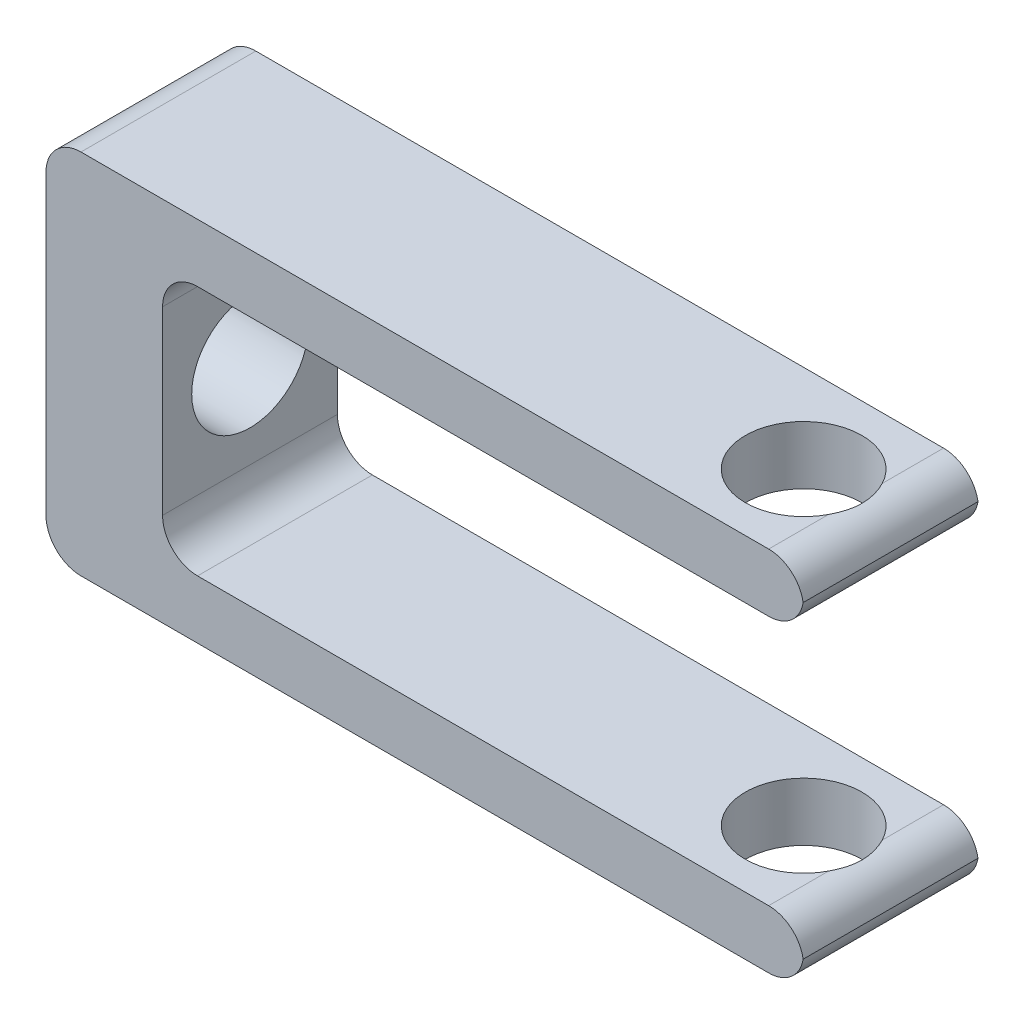
ISO-10303-21;
HEADER;
FILE_DESCRIPTION(('STEP AP214'),'2;1');
FILE_NAME('part.step','',(''),(''),'','','');
FILE_SCHEMA(('AUTOMOTIVE_DESIGN { 1 0 10303 214 1 1 1 1 }'));
ENDSEC;
DATA;
#1=APPLICATION_CONTEXT('core data for automotive mechanical design processes');
#2=APPLICATION_PROTOCOL_DEFINITION('international standard','automotive_design',2000,#1);
#3=PRODUCT_CONTEXT('',#1,'mechanical');
#4=PRODUCT('Part','Part','',(#3));
#5=PRODUCT_RELATED_PRODUCT_CATEGORY('part','',(#4));
#6=PRODUCT_DEFINITION_FORMATION('','',#4);
#7=PRODUCT_DEFINITION_CONTEXT('part definition',#1,'design');
#8=PRODUCT_DEFINITION('design','',#6,#7);
#9=PRODUCT_DEFINITION_SHAPE('','',#8);
#10=(LENGTH_UNIT() NAMED_UNIT(*) SI_UNIT(.MILLI.,.METRE.));
#11=(NAMED_UNIT(*) PLANE_ANGLE_UNIT() SI_UNIT($,.RADIAN.));
#12=(NAMED_UNIT(*) SI_UNIT($,.STERADIAN.) SOLID_ANGLE_UNIT());
#13=UNCERTAINTY_MEASURE_WITH_UNIT(LENGTH_MEASURE(1.E-05),#10,'distance_accuracy_value','');
#14=(GEOMETRIC_REPRESENTATION_CONTEXT(3) GLOBAL_UNCERTAINTY_ASSIGNED_CONTEXT((#13)) GLOBAL_UNIT_ASSIGNED_CONTEXT((#10,
#11,#12)) REPRESENTATION_CONTEXT('',''));
#15=CARTESIAN_POINT('',(0.,0.,0.));
#16=DIRECTION('',(0.,0.,1.));
#17=DIRECTION('',(1.,0.,0.));
#18=AXIS2_PLACEMENT_3D('',#15,#16,#17);
#19=CARTESIAN_POINT('',(12.7,0.,0.));
#20=DIRECTION('',(-1.,0.,0.));
#21=DIRECTION('',(0.,0.,1.));
#22=AXIS2_PLACEMENT_3D('',#19,#20,#21);
#23=PLANE('',#22);
#24=CARTESIAN_POINT('',(12.7,20.,-9.525));
#25=DIRECTION('',(-1.,0.,0.));
#26=DIRECTION('',(0.,0.,1.));
#27=AXIS2_PLACEMENT_3D('',#24,#25,#26);
#28=CIRCLE('',#27,6.35);
#29=CARTESIAN_POINT('',(12.7,20.,-3.175));
#30=VERTEX_POINT('',#29);
#31=EDGE_CURVE('E559',#30,#30,#28,.F.);
#32=ORIENTED_EDGE('',*,*,#31,.F.);
#33=EDGE_LOOP('',(#32));
#34=FACE_BOUND('',#33,.T.);
#35=DIRECTION('',(0.,1.,0.));
#36=VECTOR('',#35,1.);
#37=CARTESIAN_POINT('',(12.7,0.,-19.05));
#38=LINE('',#37,#36);
#39=CARTESIAN_POINT('',(12.7,10.16,-19.05));
#40=VERTEX_POINT('',#39);
#41=CARTESIAN_POINT('',(12.7,29.84,-19.05));
#42=VERTEX_POINT('',#41);
#43=EDGE_CURVE('E535',#40,#42,#38,.T.);
#44=ORIENTED_EDGE('',*,*,#43,.T.);
#45=DIRECTION('',(0.,0.,-1.));
#46=VECTOR('',#45,1.);
#47=CARTESIAN_POINT('',(12.7,29.84,0.));
#48=LINE('',#47,#46);
#49=CARTESIAN_POINT('',(12.7,29.84,0.));
#50=VERTEX_POINT('',#49);
#51=EDGE_CURVE('E463',#42,#50,#48,.F.);
#52=ORIENTED_EDGE('',*,*,#51,.T.);
#53=DIRECTION('',(0.,-1.,0.));
#54=VECTOR('',#53,1.);
#55=CARTESIAN_POINT('',(12.7,0.,0.));
#56=LINE('',#55,#54);
#57=CARTESIAN_POINT('',(12.7,10.16,0.));
#58=VERTEX_POINT('',#57);
#59=EDGE_CURVE('E539',#50,#58,#56,.T.);
#60=ORIENTED_EDGE('',*,*,#59,.T.);
#61=DIRECTION('',(0.,0.,1.));
#62=VECTOR('',#61,1.);
#63=CARTESIAN_POINT('',(12.7,10.16,-19.05));
#64=LINE('',#63,#62);
#65=EDGE_CURVE('E460',#58,#40,#64,.F.);
#66=ORIENTED_EDGE('',*,*,#65,.T.);
#67=EDGE_LOOP('',(#44,#52,#60,#66));
#68=FACE_BOUND('',#67,.T.);
#69=ADVANCED_FACE('F41',(#34,#68),#23,.F.);
#70=CARTESIAN_POINT('',(12.7,0.,0.));
#71=DIRECTION('',(0.,0.,-1.));
#72=DIRECTION('',(0.,1.,0.));
#73=AXIS2_PLACEMENT_3D('',#70,#71,#72);
#74=PLANE('',#73);
#75=DIRECTION('',(0.,-1.,0.));
#76=VECTOR('',#75,1.);
#77=CARTESIAN_POINT('',(0.,0.,0.));
#78=LINE('',#77,#76);
#79=CARTESIAN_POINT('',(0.,36.19,0.));
#80=VERTEX_POINT('',#79);
#81=CARTESIAN_POINT('',(0.,3.81,0.));
#82=VERTEX_POINT('',#81);
#83=EDGE_CURVE('E454',#80,#82,#78,.T.);
#84=ORIENTED_EDGE('',*,*,#83,.T.);
#85=CARTESIAN_POINT('',(3.81,3.81,0.));
#86=DIRECTION('',(0.,0.,-1.));
#87=DIRECTION('',(0.,1.,0.));
#88=AXIS2_PLACEMENT_3D('',#85,#86,#87);
#89=CIRCLE('',#88,3.81);
#90=CARTESIAN_POINT('',(3.81,0.,0.));
#91=VERTEX_POINT('',#90);
#92=EDGE_CURVE('E515',#82,#91,#89,.F.);
#93=ORIENTED_EDGE('',*,*,#92,.T.);
#94=DIRECTION('',(-1.,0.,0.));
#95=VECTOR('',#94,1.);
#96=CARTESIAN_POINT('',(12.7,0.,0.));
#97=LINE('',#96,#95);
#98=CARTESIAN_POINT('',(78.74,0.,0.));
#99=VERTEX_POINT('',#98);
#100=EDGE_CURVE('E485',#99,#91,#97,.T.);
#101=ORIENTED_EDGE('',*,*,#100,.F.);
#102=CARTESIAN_POINT('',(78.74,3.81,0.));
#103=DIRECTION('',(0.,0.,-1.));
#104=DIRECTION('',(0.,1.,0.));
#105=AXIS2_PLACEMENT_3D('',#102,#103,#104);
#106=CIRCLE('',#105,3.81);
#107=CARTESIAN_POINT('',(82.4967106622683,3.175,0.));
#108=VERTEX_POINT('',#107);
#109=EDGE_CURVE('E509',#99,#108,#106,.F.);
#110=ORIENTED_EDGE('',*,*,#109,.T.);
#111=CARTESIAN_POINT('',(78.74,2.54,0.));
#112=DIRECTION('',(0.,0.,-1.));
#113=DIRECTION('',(0.,1.,0.));
#114=AXIS2_PLACEMENT_3D('',#111,#112,#113);
#115=CIRCLE('',#114,3.81);
#116=CARTESIAN_POINT('',(78.74,6.35,0.));
#117=VERTEX_POINT('',#116);
#118=EDGE_CURVE('E511',#108,#117,#115,.F.);
#119=ORIENTED_EDGE('',*,*,#118,.T.);
#120=DIRECTION('',(-1.,0.,0.));
#121=VECTOR('',#120,1.);
#122=CARTESIAN_POINT('',(82.55,6.35,0.));
#123=LINE('',#122,#121);
#124=CARTESIAN_POINT('',(16.51,6.35,0.));
#125=VERTEX_POINT('',#124);
#126=EDGE_CURVE('E475',#117,#125,#123,.T.);
#127=ORIENTED_EDGE('',*,*,#126,.T.);
#128=CARTESIAN_POINT('',(16.51,10.16,0.));
#129=DIRECTION('',(0.,0.,-1.));
#130=DIRECTION('',(0.,1.,0.));
#131=AXIS2_PLACEMENT_3D('',#128,#129,#130);
#132=CIRCLE('',#131,3.81);
#133=EDGE_CURVE('E51',#125,#58,#132,.T.);
#134=ORIENTED_EDGE('',*,*,#133,.T.);
#135=ORIENTED_EDGE('',*,*,#59,.F.);
#136=CARTESIAN_POINT('',(16.51,29.84,0.));
#137=DIRECTION('',(0.,0.,-1.));
#138=DIRECTION('',(0.,1.,0.));
#139=AXIS2_PLACEMENT_3D('',#136,#137,#138);
#140=CIRCLE('',#139,3.81);
#141=CARTESIAN_POINT('',(16.51,33.65,0.));
#142=VERTEX_POINT('',#141);
#143=EDGE_CURVE('E459',#50,#142,#140,.T.);
#144=ORIENTED_EDGE('',*,*,#143,.T.);
#145=DIRECTION('',(-1.,0.,0.));
#146=VECTOR('',#145,1.);
#147=CARTESIAN_POINT('',(82.55,33.65,0.));
#148=LINE('',#147,#146);
#149=CARTESIAN_POINT('',(78.74,33.65,0.));
#150=VERTEX_POINT('',#149);
#151=EDGE_CURVE('E445',#150,#142,#148,.T.);
#152=ORIENTED_EDGE('',*,*,#151,.F.);
#153=CARTESIAN_POINT('',(78.74,37.46,0.));
#154=DIRECTION('',(0.,0.,-1.));
#155=DIRECTION('',(0.,1.,0.));
#156=AXIS2_PLACEMENT_3D('',#153,#154,#155);
#157=CIRCLE('',#156,3.81);
#158=CARTESIAN_POINT('',(82.4967106622683,36.825,0.));
#159=VERTEX_POINT('',#158);
#160=EDGE_CURVE('E507',#150,#159,#157,.F.);
#161=ORIENTED_EDGE('',*,*,#160,.T.);
#162=CARTESIAN_POINT('',(78.74,36.19,0.));
#163=DIRECTION('',(0.,0.,-1.));
#164=DIRECTION('',(0.,1.,0.));
#165=AXIS2_PLACEMENT_3D('',#162,#163,#164);
#166=CIRCLE('',#165,3.81);
#167=CARTESIAN_POINT('',(78.74,40.,0.));
#168=VERTEX_POINT('',#167);
#169=EDGE_CURVE('E505',#159,#168,#166,.F.);
#170=ORIENTED_EDGE('',*,*,#169,.T.);
#171=DIRECTION('',(-1.,0.,0.));
#172=VECTOR('',#171,1.);
#173=CARTESIAN_POINT('',(12.7,40.,0.));
#174=LINE('',#173,#172);
#175=CARTESIAN_POINT('',(3.81,40.,0.));
#176=VERTEX_POINT('',#175);
#177=EDGE_CURVE('E527',#168,#176,#174,.T.);
#178=ORIENTED_EDGE('',*,*,#177,.T.);
#179=CARTESIAN_POINT('',(3.81,36.19,0.));
#180=DIRECTION('',(0.,0.,-1.));
#181=DIRECTION('',(0.,1.,0.));
#182=AXIS2_PLACEMENT_3D('',#179,#180,#181);
#183=CIRCLE('',#182,3.81);
#184=EDGE_CURVE('E513',#176,#80,#183,.F.);
#185=ORIENTED_EDGE('',*,*,#184,.T.);
#186=EDGE_LOOP('',(#84,#93,#101,#110,#119,#127,#134,#135,#144,#152,#161,#170,#178,#185));
#187=FACE_BOUND('',#186,.T.);
#188=ADVANCED_FACE('F243',(#187),#74,.F.);
#189=CARTESIAN_POINT('',(12.7,0.,0.));
#190=DIRECTION('',(0.,1.,0.));
#191=DIRECTION('',(0.,0.,1.));
#192=AXIS2_PLACEMENT_3D('',#189,#190,#191);
#193=PLANE('',#192);
#194=ORIENTED_EDGE('',*,*,#100,.T.);
#195=DIRECTION('',(0.,0.,-1.));
#196=VECTOR('',#195,1.);
#197=CARTESIAN_POINT('',(3.81,0.,-19.05));
#198=LINE('',#197,#196);
#199=CARTESIAN_POINT('',(3.81,0.,-19.05));
#200=VERTEX_POINT('',#199);
#201=EDGE_CURVE('E181',#91,#200,#198,.T.);
#202=ORIENTED_EDGE('',*,*,#201,.T.);
#203=DIRECTION('',(-1.,0.,0.));
#204=VECTOR('',#203,1.);
#205=CARTESIAN_POINT('',(12.7,0.,-19.05));
#206=LINE('',#205,#204);
#207=CARTESIAN_POINT('',(78.74,0.,-19.05));
#208=VERTEX_POINT('',#207);
#209=EDGE_CURVE('E177',#208,#200,#206,.T.);
#210=ORIENTED_EDGE('',*,*,#209,.F.);
#211=DIRECTION('',(0.,0.,-1.));
#212=VECTOR('',#211,1.);
#213=CARTESIAN_POINT('',(78.74,0.,0.));
#214=LINE('',#213,#212);
#215=CARTESIAN_POINT('',(78.74,0.,-12.3676874404229));
#216=VERTEX_POINT('',#215);
#217=EDGE_CURVE('E169',#208,#216,#214,.F.);
#218=ORIENTED_EDGE('',*,*,#217,.T.);
#219=CARTESIAN_POINT('',(73.1000000000002,0.,-9.45));
#220=DIRECTION('',(0.,-1.,0.));
#221=DIRECTION('',(0.,0.,-1.));
#222=AXIS2_PLACEMENT_3D('',#219,#220,#221);
#223=CIRCLE('',#222,6.35);
#224=CARTESIAN_POINT('',(78.74,0.,-6.53231255957706));
#225=VERTEX_POINT('',#224);
#226=EDGE_CURVE('E173',#225,#216,#223,.T.);
#227=ORIENTED_EDGE('',*,*,#226,.F.);
#228=DIRECTION('',(0.,0.,-1.));
#229=VECTOR('',#228,1.);
#230=CARTESIAN_POINT('',(78.74,0.,0.));
#231=LINE('',#230,#229);
#232=EDGE_CURVE('E182',#225,#99,#231,.F.);
#233=ORIENTED_EDGE('',*,*,#232,.T.);
#234=EDGE_LOOP('',(#194,#202,#210,#218,#227,#233));
#235=FACE_BOUND('',#234,.T.);
#236=ADVANCED_FACE('F172',(#235),#193,.F.);
#237=CARTESIAN_POINT('',(12.7,0.,-19.05));
#238=DIRECTION('',(0.,0.,1.));
#239=DIRECTION('',(0.,-1.,0.));
#240=AXIS2_PLACEMENT_3D('',#237,#238,#239);
#241=PLANE('',#240);
#242=ORIENTED_EDGE('',*,*,#209,.T.);
#243=CARTESIAN_POINT('',(3.81,3.81,-19.05));
#244=DIRECTION('',(0.,0.,1.));
#245=DIRECTION('',(0.,-1.,0.));
#246=AXIS2_PLACEMENT_3D('',#243,#244,#245);
#247=CIRCLE('',#246,3.81);
#248=CARTESIAN_POINT('',(0.,3.81,-19.05));
#249=VERTEX_POINT('',#248);
#250=EDGE_CURVE('E499',#200,#249,#247,.F.);
#251=ORIENTED_EDGE('',*,*,#250,.T.);
#252=DIRECTION('',(0.,1.,0.));
#253=VECTOR('',#252,1.);
#254=CARTESIAN_POINT('',(0.,0.,-19.05));
#255=LINE('',#254,#253);
#256=CARTESIAN_POINT('',(0.,36.19,-19.05));
#257=VERTEX_POINT('',#256);
#258=EDGE_CURVE('E542',#249,#257,#255,.T.);
#259=ORIENTED_EDGE('',*,*,#258,.T.);
#260=CARTESIAN_POINT('',(3.81,36.19,-19.05));
#261=DIRECTION('',(0.,0.,1.));
#262=DIRECTION('',(0.,-1.,0.));
#263=AXIS2_PLACEMENT_3D('',#260,#261,#262);
#264=CIRCLE('',#263,3.81);
#265=CARTESIAN_POINT('',(3.81,40.,-19.05));
#266=VERTEX_POINT('',#265);
#267=EDGE_CURVE('E497',#257,#266,#264,.F.);
#268=ORIENTED_EDGE('',*,*,#267,.T.);
#269=DIRECTION('',(-1.,0.,0.));
#270=VECTOR('',#269,1.);
#271=CARTESIAN_POINT('',(12.7,40.,-19.05));
#272=LINE('',#271,#270);
#273=CARTESIAN_POINT('',(78.74,40.,-19.05));
#274=VERTEX_POINT('',#273);
#275=EDGE_CURVE('E530',#274,#266,#272,.T.);
#276=ORIENTED_EDGE('',*,*,#275,.F.);
#277=CARTESIAN_POINT('',(78.74,36.19,-19.05));
#278=DIRECTION('',(0.,0.,1.));
#279=DIRECTION('',(0.,-1.,0.));
#280=AXIS2_PLACEMENT_3D('',#277,#278,#279);
#281=CIRCLE('',#280,3.81);
#282=CARTESIAN_POINT('',(82.4967106622683,36.825,-19.05));
#283=VERTEX_POINT('',#282);
#284=EDGE_CURVE('E489',#274,#283,#281,.F.);
#285=ORIENTED_EDGE('',*,*,#284,.T.);
#286=CARTESIAN_POINT('',(78.74,37.46,-19.05));
#287=DIRECTION('',(0.,0.,1.));
#288=DIRECTION('',(0.,-1.,0.));
#289=AXIS2_PLACEMENT_3D('',#286,#287,#288);
#290=CIRCLE('',#289,3.81);
#291=CARTESIAN_POINT('',(78.74,33.65,-19.05));
#292=VERTEX_POINT('',#291);
#293=EDGE_CURVE('E491',#283,#292,#290,.F.);
#294=ORIENTED_EDGE('',*,*,#293,.T.);
#295=DIRECTION('',(-1.,0.,0.));
#296=VECTOR('',#295,1.);
#297=CARTESIAN_POINT('',(82.55,33.65,-19.05));
#298=LINE('',#297,#296);
#299=CARTESIAN_POINT('',(16.51,33.65,-19.05));
#300=VERTEX_POINT('',#299);
#301=EDGE_CURVE('E455',#292,#300,#298,.T.);
#302=ORIENTED_EDGE('',*,*,#301,.T.);
#303=CARTESIAN_POINT('',(16.51,29.84,-19.05));
#304=DIRECTION('',(0.,0.,1.));
#305=DIRECTION('',(0.,-1.,0.));
#306=AXIS2_PLACEMENT_3D('',#303,#304,#305);
#307=CIRCLE('',#306,3.81);
#308=EDGE_CURVE('E231',#300,#42,#307,.T.);
#309=ORIENTED_EDGE('',*,*,#308,.T.);
#310=ORIENTED_EDGE('',*,*,#43,.F.);
#311=CARTESIAN_POINT('',(16.51,10.16,-19.05));
#312=DIRECTION('',(0.,0.,1.));
#313=DIRECTION('',(0.,-1.,0.));
#314=AXIS2_PLACEMENT_3D('',#311,#312,#313);
#315=CIRCLE('',#314,3.81);
#316=CARTESIAN_POINT('',(16.51,6.35,-19.05));
#317=VERTEX_POINT('',#316);
#318=EDGE_CURVE('E11',#40,#317,#315,.T.);
#319=ORIENTED_EDGE('',*,*,#318,.T.);
#320=DIRECTION('',(-1.,0.,0.));
#321=VECTOR('',#320,1.);
#322=CARTESIAN_POINT('',(82.55,6.35,-19.05));
#323=LINE('',#322,#321);
#324=CARTESIAN_POINT('',(78.74,6.35,-19.05));
#325=VERTEX_POINT('',#324);
#326=EDGE_CURVE('E556',#325,#317,#323,.T.);
#327=ORIENTED_EDGE('',*,*,#326,.F.);
#328=CARTESIAN_POINT('',(78.74,2.54,-19.05));
#329=DIRECTION('',(0.,0.,1.));
#330=DIRECTION('',(0.,-1.,0.));
#331=AXIS2_PLACEMENT_3D('',#328,#329,#330);
#332=CIRCLE('',#331,3.81);
#333=CARTESIAN_POINT('',(82.4967106622683,3.175,-19.05));
#334=VERTEX_POINT('',#333);
#335=EDGE_CURVE('E495',#325,#334,#332,.F.);
#336=ORIENTED_EDGE('',*,*,#335,.T.);
#337=CARTESIAN_POINT('',(78.74,3.81,-19.05));
#338=DIRECTION('',(0.,0.,1.));
#339=DIRECTION('',(0.,-1.,0.));
#340=AXIS2_PLACEMENT_3D('',#337,#338,#339);
#341=CIRCLE('',#340,3.81);
#342=EDGE_CURVE('E493',#334,#208,#341,.F.);
#343=ORIENTED_EDGE('',*,*,#342,.T.);
#344=EDGE_LOOP('',(#242,#251,#259,#268,#276,#285,#294,#302,#309,#310,#319,#327,#336,#343));
#345=FACE_BOUND('',#344,.T.);
#346=ADVANCED_FACE('F263',(#345),#241,.F.);
#347=CARTESIAN_POINT('',(12.7,40.,0.));
#348=DIRECTION('',(0.,-1.,0.));
#349=DIRECTION('',(0.,0.,-1.));
#350=AXIS2_PLACEMENT_3D('',#347,#348,#349);
#351=PLANE('',#350);
#352=ORIENTED_EDGE('',*,*,#275,.T.);
#353=DIRECTION('',(0.,0.,1.));
#354=VECTOR('',#353,1.);
#355=CARTESIAN_POINT('',(3.81,40.,0.));
#356=LINE('',#355,#354);
#357=EDGE_CURVE('E521',#266,#176,#356,.T.);
#358=ORIENTED_EDGE('',*,*,#357,.T.);
#359=ORIENTED_EDGE('',*,*,#177,.F.);
#360=DIRECTION('',(0.,0.,1.));
#361=VECTOR('',#360,1.);
#362=CARTESIAN_POINT('',(78.74,40.,-19.05));
#363=LINE('',#362,#361);
#364=CARTESIAN_POINT('',(78.74,40.,-6.53231255957706));
#365=VERTEX_POINT('',#364);
#366=EDGE_CURVE('E519',#168,#365,#363,.F.);
#367=ORIENTED_EDGE('',*,*,#366,.T.);
#368=CARTESIAN_POINT('',(73.1000000000002,40.,-9.45));
#369=DIRECTION('',(0.,-1.,0.));
#370=DIRECTION('',(0.,0.,-1.));
#371=AXIS2_PLACEMENT_3D('',#368,#369,#370);
#372=CIRCLE('',#371,6.35);
#373=CARTESIAN_POINT('',(78.74,40.,-12.3676874404229));
#374=VERTEX_POINT('',#373);
#375=EDGE_CURVE('E187',#365,#374,#372,.T.);
#376=ORIENTED_EDGE('',*,*,#375,.T.);
#377=DIRECTION('',(0.,0.,1.));
#378=VECTOR('',#377,1.);
#379=CARTESIAN_POINT('',(78.74,40.,-19.05));
#380=LINE('',#379,#378);
#381=EDGE_CURVE('E517',#374,#274,#380,.F.);
#382=ORIENTED_EDGE('',*,*,#381,.T.);
#383=EDGE_LOOP('',(#352,#358,#359,#367,#376,#382));
#384=FACE_BOUND('',#383,.T.);
#385=ADVANCED_FACE('F259',(#384),#351,.F.);
#386=CARTESIAN_POINT('',(0.,0.,0.));
#387=DIRECTION('',(-1.,0.,0.));
#388=DIRECTION('',(0.,0.,1.));
#389=AXIS2_PLACEMENT_3D('',#386,#387,#388);
#390=PLANE('',#389);
#391=CARTESIAN_POINT('',(0.,20.,-9.525));
#392=DIRECTION('',(-1.,0.,0.));
#393=DIRECTION('',(0.,0.,1.));
#394=AXIS2_PLACEMENT_3D('',#391,#392,#393);
#395=CIRCLE('',#394,6.35);
#396=CARTESIAN_POINT('',(0.,20.,-3.175));
#397=VERTEX_POINT('',#396);
#398=EDGE_CURVE('E479',#397,#397,#395,.T.);
#399=ORIENTED_EDGE('',*,*,#398,.F.);
#400=EDGE_LOOP('',(#399));
#401=FACE_BOUND('',#400,.T.);
#402=ORIENTED_EDGE('',*,*,#258,.F.);
#403=DIRECTION('',(0.,0.,-1.));
#404=VECTOR('',#403,1.);
#405=CARTESIAN_POINT('',(0.,3.81,0.));
#406=LINE('',#405,#404);
#407=EDGE_CURVE('E503',#249,#82,#406,.F.);
#408=ORIENTED_EDGE('',*,*,#407,.T.);
#409=ORIENTED_EDGE('',*,*,#83,.F.);
#410=DIRECTION('',(0.,0.,1.));
#411=VECTOR('',#410,1.);
#412=CARTESIAN_POINT('',(0.,36.19,-19.05));
#413=LINE('',#412,#411);
#414=EDGE_CURVE('E501',#80,#257,#413,.F.);
#415=ORIENTED_EDGE('',*,*,#414,.T.);
#416=EDGE_LOOP('',(#402,#408,#409,#415));
#417=FACE_BOUND('',#416,.T.);
#418=ADVANCED_FACE('F256',(#401,#417),#390,.T.);
#419=CARTESIAN_POINT('',(82.55,33.65,0.));
#420=DIRECTION('',(0.,1.,0.));
#421=DIRECTION('',(0.,0.,1.));
#422=AXIS2_PLACEMENT_3D('',#419,#420,#421);
#423=PLANE('',#422);
#424=ORIENTED_EDGE('',*,*,#151,.T.);
#425=DIRECTION('',(0.,0.,-1.));
#426=VECTOR('',#425,1.);
#427=CARTESIAN_POINT('',(16.51,33.65,-19.05));
#428=LINE('',#427,#426);
#429=EDGE_CURVE('E448',#142,#300,#428,.T.);
#430=ORIENTED_EDGE('',*,*,#429,.T.);
#431=ORIENTED_EDGE('',*,*,#301,.F.);
#432=DIRECTION('',(0.,0.,-1.));
#433=VECTOR('',#432,1.);
#434=CARTESIAN_POINT('',(78.74,33.65,0.));
#435=LINE('',#434,#433);
#436=CARTESIAN_POINT('',(78.74,33.65,-12.3676874404229));
#437=VERTEX_POINT('',#436);
#438=EDGE_CURVE('E461',#292,#437,#435,.F.);
#439=ORIENTED_EDGE('',*,*,#438,.T.);
#440=CARTESIAN_POINT('',(73.1000000000002,33.65,-9.45));
#441=DIRECTION('',(0.,1.,0.));
#442=DIRECTION('',(0.,0.,1.));
#443=AXIS2_PLACEMENT_3D('',#440,#441,#442);
#444=CIRCLE('',#443,6.35);
#445=CARTESIAN_POINT('',(78.74,33.65,-6.53231255957706));
#446=VERTEX_POINT('',#445);
#447=EDGE_CURVE('E477',#437,#446,#444,.T.);
#448=ORIENTED_EDGE('',*,*,#447,.T.);
#449=DIRECTION('',(0.,0.,-1.));
#450=VECTOR('',#449,1.);
#451=CARTESIAN_POINT('',(78.74,33.65,0.));
#452=LINE('',#451,#450);
#453=EDGE_CURVE('E452',#446,#150,#452,.F.);
#454=ORIENTED_EDGE('',*,*,#453,.T.);
#455=EDGE_LOOP('',(#424,#430,#431,#439,#448,#454));
#456=FACE_BOUND('',#455,.T.);
#457=ADVANCED_FACE('F255',(#456),#423,.F.);
#458=CARTESIAN_POINT('',(82.55,6.35,0.));
#459=DIRECTION('',(0.,-1.,0.));
#460=DIRECTION('',(0.,0.,-1.));
#461=AXIS2_PLACEMENT_3D('',#458,#459,#460);
#462=PLANE('',#461);
#463=ORIENTED_EDGE('',*,*,#326,.T.);
#464=DIRECTION('',(0.,0.,1.));
#465=VECTOR('',#464,1.);
#466=CARTESIAN_POINT('',(16.51,6.35,0.));
#467=LINE('',#466,#465);
#468=EDGE_CURVE('E192',#317,#125,#467,.T.);
#469=ORIENTED_EDGE('',*,*,#468,.T.);
#470=ORIENTED_EDGE('',*,*,#126,.F.);
#471=DIRECTION('',(0.,0.,1.));
#472=VECTOR('',#471,1.);
#473=CARTESIAN_POINT('',(78.74,6.35,0.));
#474=LINE('',#473,#472);
#475=CARTESIAN_POINT('',(78.74,6.35,-6.53231255957706));
#476=VERTEX_POINT('',#475);
#477=EDGE_CURVE('E197',#117,#476,#474,.F.);
#478=ORIENTED_EDGE('',*,*,#477,.T.);
#479=CARTESIAN_POINT('',(73.1000000000002,6.35,-9.45));
#480=DIRECTION('',(0.,-1.,0.));
#481=DIRECTION('',(0.,0.,-1.));
#482=AXIS2_PLACEMENT_3D('',#479,#480,#481);
#483=CIRCLE('',#482,6.35);
#484=CARTESIAN_POINT('',(78.74,6.35,-12.3676874404229));
#485=VERTEX_POINT('',#484);
#486=EDGE_CURVE('E473',#476,#485,#483,.T.);
#487=ORIENTED_EDGE('',*,*,#486,.T.);
#488=DIRECTION('',(0.,0.,1.));
#489=VECTOR('',#488,1.);
#490=CARTESIAN_POINT('',(78.74,6.35,0.));
#491=LINE('',#490,#489);
#492=EDGE_CURVE('E470',#485,#325,#491,.F.);
#493=ORIENTED_EDGE('',*,*,#492,.T.);
#494=EDGE_LOOP('',(#463,#469,#470,#478,#487,#493));
#495=FACE_BOUND('',#494,.T.);
#496=ADVANCED_FACE('F315',(#495),#462,.F.);
#497=CARTESIAN_POINT('',(82.551,20.,-9.525));
#498=DIRECTION('',(-1.,0.,0.));
#499=DIRECTION('',(0.,0.,1.));
#500=AXIS2_PLACEMENT_3D('',#497,#498,#499);
#501=CYLINDRICAL_SURFACE('',#500,6.35);
#502=ORIENTED_EDGE('',*,*,#398,.T.);
#503=EDGE_LOOP('',(#502));
#504=FACE_BOUND('',#503,.T.);
#505=ORIENTED_EDGE('',*,*,#31,.T.);
#506=EDGE_LOOP('',(#505));
#507=FACE_BOUND('',#506,.T.);
#508=ADVANCED_FACE('F217',(#504,#507),#501,.F.);
#509=CARTESIAN_POINT('',(73.1000000000002,40.,-9.45));
#510=DIRECTION('',(0.,-1.,0.));
#511=DIRECTION('',(0.,0.,-1.));
#512=AXIS2_PLACEMENT_3D('',#509,#510,#511);
#513=CYLINDRICAL_SURFACE('',#512,6.35);
#514=ORIENTED_EDGE('',*,*,#226,.T.);
#515=CARTESIAN_POINT('',(78.74,0.,-12.3676874404229));
#516=CARTESIAN_POINT('',(78.8141669430321,4.21677638576509E-05,-12.2243462053904));
#517=CARTESIAN_POINT('',(78.8828322778943,0.0021667541477509,-12.0781973111076));
#518=CARTESIAN_POINT('',(79.0088135503706,0.00896028764189701,-11.7811794488519));
#519=CARTESIAN_POINT('',(79.0661321126513,0.0136286454026258,-11.6303115818152));
#520=CARTESIAN_POINT('',(79.1690733661252,0.0238872818431314,-11.3247875636011));
#521=CARTESIAN_POINT('',(79.2147039703366,0.0294769325502578,-11.1701340535195));
#522=CARTESIAN_POINT('',(79.294079587128,0.0402909916585191,-10.857780161327));
#523=CARTESIAN_POINT('',(79.3278234806986,0.0455153656355876,-10.7000794938313));
#524=CARTESIAN_POINT('',(79.3859896577,0.0550355613227927,-10.3666551310219));
#525=CARTESIAN_POINT('',(79.4091443727042,0.0591865335181194,-10.1907044329168));
#526=CARTESIAN_POINT('',(79.4406503181169,0.0649437699426842,-9.8374330942771));
#527=CARTESIAN_POINT('',(79.4490007868683,0.066549903243158,-9.66011238372875));
#528=CARTESIAN_POINT('',(79.4508303461197,0.0668968475096115,-9.30537955210745));
#529=CARTESIAN_POINT('',(79.4443084961887,0.0656374772793295,-9.12796742596318));
#530=CARTESIAN_POINT('',(79.4164435733036,0.0605034551550137,-8.77435675750611));
#531=CARTESIAN_POINT('',(79.3951010794083,0.0566289054390558,-8.59815816805073));
#532=CARTESIAN_POINT('',(79.3394902189645,0.0473612079869808,-8.25877188026996));
#533=CARTESIAN_POINT('',(79.3060785890245,0.0420736819041759,-8.09544014147094));
#534=CARTESIAN_POINT('',(79.2265290140866,0.03097877341459,-7.77193892812828));
#535=CARTESIAN_POINT('',(79.1803918552078,0.0251714231348945,-7.61176925890263));
#536=CARTESIAN_POINT('',(79.075602250961,0.0144438143421923,-7.29536133191125));
#537=CARTESIAN_POINT('',(79.0169384791843,0.00952436613740139,-7.13912677611383));
#538=CARTESIAN_POINT('',(78.9198484592949,0.00410963397721732,-6.90857802913846));
#539=CARTESIAN_POINT('',(78.8859620500257,0.0026320354643742,-6.83234809663053));
#540=CARTESIAN_POINT('',(78.8152060066899,0.000578306783763317,-6.68126783508091));
#541=CARTESIAN_POINT('',(78.7783361855512,2.23319142178353E-06,-6.60641759291329));
#542=CARTESIAN_POINT('',(78.74,0.,-6.53231255957706));
#543=B_SPLINE_CURVE_WITH_KNOTS('',3,(#515,#516,#517,#518,#519,#520,#521,#522,#523,#524,#525,
#526,#527,#528,#529,#530,#531,#532,#533,#534,#535,#536,#537,#538,#539,#540,#541,#542),
.UNSPECIFIED.,.F.,.F.,(4,2,2,2,2,2,2,2,2,2,2,2,2,4),(0.,0.483999250872301,0.967886414816064,
1.45144510484421,1.93504930470226,2.46695277393833,2.99888360805118,3.53084807902966,
4.06279176674635,4.56266943435482,5.06251622895115,5.56281690723442,5.81306286888241,
6.06332453414986),.UNSPECIFIED.);
#544=EDGE_CURVE('E186',#216,#225,#543,.T.);
#545=ORIENTED_EDGE('',*,*,#544,.T.);
#546=EDGE_LOOP('',(#514,#545));
#547=FACE_BOUND('',#546,.T.);
#548=ORIENTED_EDGE('',*,*,#486,.F.);
#549=CARTESIAN_POINT('',(78.74,6.35,-6.53231255957706));
#550=CARTESIAN_POINT('',(78.8141669430321,6.34995783223614,-6.67565379460957));
#551=CARTESIAN_POINT('',(78.8828322778943,6.34783324585225,-6.82180268889242));
#552=CARTESIAN_POINT('',(79.0088135503706,6.3410397123581,-7.11882055114807));
#553=CARTESIAN_POINT('',(79.0661321126513,6.33637135459737,-7.26968841818478));
#554=CARTESIAN_POINT('',(79.1690733661252,6.32611271815687,-7.57521243639892));
#555=CARTESIAN_POINT('',(79.2147039703366,6.32052306744974,-7.72986594648046));
#556=CARTESIAN_POINT('',(79.294079587128,6.30970900834148,-8.04221983867304));
#557=CARTESIAN_POINT('',(79.3278234806986,6.30448463436441,-8.19992050616873));
#558=CARTESIAN_POINT('',(79.3859896577,6.29496443867721,-8.53334486897812));
#559=CARTESIAN_POINT('',(79.4091443727042,6.29081346648188,-8.70929556708324));
#560=CARTESIAN_POINT('',(79.4406503181169,6.28505623005732,-9.0625669057229));
#561=CARTESIAN_POINT('',(79.4490007868683,6.28345009675684,-9.23988761627125));
#562=CARTESIAN_POINT('',(79.4508303461197,6.28310315249039,-9.59462044789254));
#563=CARTESIAN_POINT('',(79.4443084961887,6.28436252272067,-9.77203257403681));
#564=CARTESIAN_POINT('',(79.4164435733036,6.28949654484499,-10.1256432424939));
#565=CARTESIAN_POINT('',(79.3951010794083,6.29337109456094,-10.3018418319493));
#566=CARTESIAN_POINT('',(79.3394902189645,6.30263879201302,-10.64122811973));
#567=CARTESIAN_POINT('',(79.3060785890245,6.30792631809582,-10.8045598585291));
#568=CARTESIAN_POINT('',(79.2265290140866,6.31902122658541,-11.1280610718717));
#569=CARTESIAN_POINT('',(79.1803918552078,6.32482857686511,-11.2882307410974));
#570=CARTESIAN_POINT('',(79.075602250961,6.33555618565781,-11.6046386680887));
#571=CARTESIAN_POINT('',(79.0169384791843,6.3404756338626,-11.7608732238862));
#572=CARTESIAN_POINT('',(78.9198484592949,6.34589036602278,-11.9914219708615));
#573=CARTESIAN_POINT('',(78.8859620500257,6.34736796453563,-12.0676519033695));
#574=CARTESIAN_POINT('',(78.8152060066899,6.34942169321624,-12.2187321649191));
#575=CARTESIAN_POINT('',(78.7783361855512,6.34999776680858,-12.2935824070867));
#576=CARTESIAN_POINT('',(78.74,6.35,-12.3676874404229));
#577=B_SPLINE_CURVE_WITH_KNOTS('',3,(#549,#550,#551,#552,#553,#554,#555,#556,#557,#558,#559,
#560,#561,#562,#563,#564,#565,#566,#567,#568,#569,#570,#571,#572,#573,#574,#575,#576),
.UNSPECIFIED.,.F.,.F.,(4,2,2,2,2,2,2,2,2,2,2,2,2,4),(0.,0.483999250872301,0.967886414816063,
1.45144510484421,1.93504930470226,2.46695277393833,2.99888360805118,3.53084807902966,
4.06279176674635,4.56266943435482,5.06251622895115,5.56281690723442,5.81306286888241,
6.06332453414986),.UNSPECIFIED.);
#578=EDGE_CURVE('E59',#476,#485,#577,.T.);
#579=ORIENTED_EDGE('',*,*,#578,.T.);
#580=EDGE_LOOP('',(#548,#579));
#581=FACE_BOUND('',#580,.T.);
#582=ADVANCED_FACE('F185',(#547,#581),#513,.F.);
#583=ORIENTED_EDGE('',*,*,#375,.F.);
#584=CARTESIAN_POINT('',(78.74,40.,-6.53231255957706));
#585=CARTESIAN_POINT('',(78.8141669430321,39.9999578322361,-6.67565379460956));
#586=CARTESIAN_POINT('',(78.8828322778943,39.9978332458522,-6.82180268889242));
#587=CARTESIAN_POINT('',(79.0088135503706,39.9910397123581,-7.11882055114807));
#588=CARTESIAN_POINT('',(79.0661321126513,39.9863713545974,-7.26968841818478));
#589=CARTESIAN_POINT('',(79.1690733661252,39.9761127181569,-7.57521243639892));
#590=CARTESIAN_POINT('',(79.2147039703366,39.9705230674497,-7.72986594648046));
#591=CARTESIAN_POINT('',(79.294079587128,39.9597090083415,-8.04221983867304));
#592=CARTESIAN_POINT('',(79.3278234806986,39.9544846343644,-8.19992050616873));
#593=CARTESIAN_POINT('',(79.3859896577,39.9449644386772,-8.53334486897812));
#594=CARTESIAN_POINT('',(79.4091443727042,39.9408134664819,-8.70929556708324));
#595=CARTESIAN_POINT('',(79.4406503181169,39.9350562300573,-9.0625669057229));
#596=CARTESIAN_POINT('',(79.4490007868683,39.9334500967568,-9.23988761627125));
#597=CARTESIAN_POINT('',(79.4508303461197,39.9331031524904,-9.59462044789254));
#598=CARTESIAN_POINT('',(79.4443084961887,39.9343625227207,-9.77203257403681));
#599=CARTESIAN_POINT('',(79.4164435733036,39.939496544845,-10.1256432424939));
#600=CARTESIAN_POINT('',(79.3951010794083,39.9433710945609,-10.3018418319493));
#601=CARTESIAN_POINT('',(79.3394902189645,39.952638792013,-10.64122811973));
#602=CARTESIAN_POINT('',(79.3060785890245,39.9579263180958,-10.8045598585291));
#603=CARTESIAN_POINT('',(79.2265290140866,39.9690212265854,-11.1280610718717));
#604=CARTESIAN_POINT('',(79.1803918552078,39.9748285768651,-11.2882307410974));
#605=CARTESIAN_POINT('',(79.075602250961,39.9855561856578,-11.6046386680887));
#606=CARTESIAN_POINT('',(79.0169384791843,39.9904756338626,-11.7608732238862));
#607=CARTESIAN_POINT('',(78.9198484592949,39.9958903660228,-11.9914219708615));
#608=CARTESIAN_POINT('',(78.8859620500257,39.9973679645356,-12.0676519033695));
#609=CARTESIAN_POINT('',(78.8152060066899,39.9994216932162,-12.2187321649191));
#610=CARTESIAN_POINT('',(78.7783361855512,39.9999977668086,-12.2935824070867));
#611=CARTESIAN_POINT('',(78.74,40.,-12.3676874404229));
#612=B_SPLINE_CURVE_WITH_KNOTS('',3,(#584,#585,#586,#587,#588,#589,#590,#591,#592,#593,#594,
#595,#596,#597,#598,#599,#600,#601,#602,#603,#604,#605,#606,#607,#608,#609,#610,#611),
.UNSPECIFIED.,.F.,.F.,(4,2,2,2,2,2,2,2,2,2,2,2,2,4),(0.,0.483999250872301,0.967886414816063,
1.45144510484421,1.93504930470226,2.46695277393833,2.99888360805118,3.53084807902966,
4.06279176674635,4.56266943435482,5.06251622895115,5.56281690723442,5.81306286888241,
6.06332453414986),.UNSPECIFIED.);
#613=EDGE_CURVE('E194',#365,#374,#612,.T.);
#614=ORIENTED_EDGE('',*,*,#613,.T.);
#615=EDGE_LOOP('',(#583,#614));
#616=FACE_BOUND('',#615,.T.);
#617=ORIENTED_EDGE('',*,*,#447,.F.);
#618=CARTESIAN_POINT('',(78.74,33.65,-12.3676874404229));
#619=CARTESIAN_POINT('',(78.8141669430321,33.6500421677639,-12.2243462053904));
#620=CARTESIAN_POINT('',(78.8828322778943,33.6521667541477,-12.0781973111076));
#621=CARTESIAN_POINT('',(79.0088135503706,33.6589602876419,-11.7811794488519));
#622=CARTESIAN_POINT('',(79.0661321126513,33.6636286454026,-11.6303115818152));
#623=CARTESIAN_POINT('',(79.1690733661252,33.6738872818431,-11.3247875636011));
#624=CARTESIAN_POINT('',(79.2147039703366,33.6794769325503,-11.1701340535195));
#625=CARTESIAN_POINT('',(79.294079587128,33.6902909916585,-10.857780161327));
#626=CARTESIAN_POINT('',(79.3278234806986,33.6955153656356,-10.7000794938313));
#627=CARTESIAN_POINT('',(79.3859896577,33.7050355613228,-10.3666551310219));
#628=CARTESIAN_POINT('',(79.4091443727042,33.7091865335181,-10.1907044329168));
#629=CARTESIAN_POINT('',(79.4406503181169,33.7149437699427,-9.8374330942771));
#630=CARTESIAN_POINT('',(79.4490007868683,33.7165499032432,-9.66011238372875));
#631=CARTESIAN_POINT('',(79.4508303461197,33.7168968475096,-9.30537955210745));
#632=CARTESIAN_POINT('',(79.4443084961887,33.7156374772793,-9.12796742596318));
#633=CARTESIAN_POINT('',(79.4164435733036,33.710503455155,-8.77435675750611));
#634=CARTESIAN_POINT('',(79.3951010794083,33.7066289054391,-8.59815816805073));
#635=CARTESIAN_POINT('',(79.3394902189645,33.697361207987,-8.25877188026996));
#636=CARTESIAN_POINT('',(79.3060785890245,33.6920736819042,-8.09544014147094));
#637=CARTESIAN_POINT('',(79.2265290140866,33.6809787734146,-7.77193892812828));
#638=CARTESIAN_POINT('',(79.1803918552078,33.6751714231349,-7.61176925890263));
#639=CARTESIAN_POINT('',(79.075602250961,33.6644438143422,-7.29536133191125));
#640=CARTESIAN_POINT('',(79.0169384791843,33.6595243661374,-7.13912677611383));
#641=CARTESIAN_POINT('',(78.9198484592949,33.6541096339772,-6.90857802913846));
#642=CARTESIAN_POINT('',(78.8859620500257,33.6526320354644,-6.83234809663053));
#643=CARTESIAN_POINT('',(78.8152060066899,33.6505783067838,-6.68126783508091));
#644=CARTESIAN_POINT('',(78.7783361855512,33.6500022331914,-6.60641759291329));
#645=CARTESIAN_POINT('',(78.74,33.65,-6.53231255957706));
#646=B_SPLINE_CURVE_WITH_KNOTS('',3,(#618,#619,#620,#621,#622,#623,#624,#625,#626,#627,#628,
#629,#630,#631,#632,#633,#634,#635,#636,#637,#638,#639,#640,#641,#642,#643,#644,#645),
.UNSPECIFIED.,.F.,.F.,(4,2,2,2,2,2,2,2,2,2,2,2,2,4),(0.,0.483999250872301,0.967886414816064,
1.45144510484421,1.93504930470226,2.46695277393833,2.99888360805118,3.53084807902966,
4.06279176674635,4.56266943435482,5.06251622895115,5.56281690723442,5.81306286888241,
6.06332453414986),.UNSPECIFIED.);
#647=EDGE_CURVE('E226',#437,#446,#646,.T.);
#648=ORIENTED_EDGE('',*,*,#647,.T.);
#649=EDGE_LOOP('',(#617,#648));
#650=FACE_BOUND('',#649,.T.);
#651=ADVANCED_FACE('F211',(#616,#650),#513,.F.);
#652=CARTESIAN_POINT('',(3.81,3.81,0.));
#653=DIRECTION('',(0.,0.,1.));
#654=DIRECTION('',(1.,0.,0.));
#655=AXIS2_PLACEMENT_3D('',#652,#653,#654);
#656=CYLINDRICAL_SURFACE('',#655,3.81);
#657=ORIENTED_EDGE('',*,*,#92,.F.);
#658=ORIENTED_EDGE('',*,*,#407,.F.);
#659=ORIENTED_EDGE('',*,*,#250,.F.);
#660=ORIENTED_EDGE('',*,*,#201,.F.);
#661=EDGE_LOOP('',(#657,#658,#659,#660));
#662=FACE_BOUND('',#661,.T.);
#663=ADVANCED_FACE('F215',(#662),#656,.T.);
#664=CARTESIAN_POINT('',(3.81,36.19,0.));
#665=DIRECTION('',(0.,0.,-1.));
#666=DIRECTION('',(-1.,0.,0.));
#667=AXIS2_PLACEMENT_3D('',#664,#665,#666);
#668=CYLINDRICAL_SURFACE('',#667,3.81);
#669=ORIENTED_EDGE('',*,*,#267,.F.);
#670=ORIENTED_EDGE('',*,*,#414,.F.);
#671=ORIENTED_EDGE('',*,*,#184,.F.);
#672=ORIENTED_EDGE('',*,*,#357,.F.);
#673=EDGE_LOOP('',(#669,#670,#671,#672));
#674=FACE_BOUND('',#673,.T.);
#675=ADVANCED_FACE('F272',(#674),#668,.T.);
#676=CARTESIAN_POINT('',(16.51,29.84,0.));
#677=DIRECTION('',(0.,0.,1.));
#678=DIRECTION('',(1.,0.,0.));
#679=AXIS2_PLACEMENT_3D('',#676,#677,#678);
#680=CYLINDRICAL_SURFACE('',#679,3.81);
#681=ORIENTED_EDGE('',*,*,#143,.F.);
#682=ORIENTED_EDGE('',*,*,#51,.F.);
#683=ORIENTED_EDGE('',*,*,#308,.F.);
#684=ORIENTED_EDGE('',*,*,#429,.F.);
#685=EDGE_LOOP('',(#681,#682,#683,#684));
#686=FACE_BOUND('',#685,.T.);
#687=ADVANCED_FACE('F276',(#686),#680,.F.);
#688=CARTESIAN_POINT('',(16.51,10.16,0.));
#689=DIRECTION('',(0.,0.,-1.));
#690=DIRECTION('',(-1.,0.,0.));
#691=AXIS2_PLACEMENT_3D('',#688,#689,#690);
#692=CYLINDRICAL_SURFACE('',#691,3.81);
#693=ORIENTED_EDGE('',*,*,#318,.F.);
#694=ORIENTED_EDGE('',*,*,#65,.F.);
#695=ORIENTED_EDGE('',*,*,#133,.F.);
#696=ORIENTED_EDGE('',*,*,#468,.F.);
#697=EDGE_LOOP('',(#693,#694,#695,#696));
#698=FACE_BOUND('',#697,.T.);
#699=ADVANCED_FACE('F280',(#698),#692,.F.);
#700=CARTESIAN_POINT('',(78.74,3.81,0.));
#701=DIRECTION('',(0.,0.,-1.));
#702=DIRECTION('',(-1.,0.,0.));
#703=AXIS2_PLACEMENT_3D('',#700,#701,#702);
#704=CYLINDRICAL_SURFACE('',#703,3.81);
#705=ORIENTED_EDGE('',*,*,#217,.F.);
#706=ORIENTED_EDGE('',*,*,#342,.F.);
#707=DIRECTION('',(0.,0.,-1.));
#708=VECTOR('',#707,1.);
#709=CARTESIAN_POINT('',(82.4967106622683,3.175,-9.525));
#710=LINE('',#709,#708);
#711=EDGE_CURVE('E188',#108,#334,#710,.T.);
#712=ORIENTED_EDGE('',*,*,#711,.F.);
#713=ORIENTED_EDGE('',*,*,#109,.F.);
#714=ORIENTED_EDGE('',*,*,#232,.F.);
#715=ORIENTED_EDGE('',*,*,#544,.F.);
#716=EDGE_LOOP('',(#705,#706,#712,#713,#714,#715));
#717=FACE_BOUND('',#716,.T.);
#718=ADVANCED_FACE('F190',(#717),#704,.T.);
#719=CARTESIAN_POINT('',(78.74,2.54,0.));
#720=DIRECTION('',(0.,0.,1.));
#721=DIRECTION('',(1.,0.,0.));
#722=AXIS2_PLACEMENT_3D('',#719,#720,#721);
#723=CYLINDRICAL_SURFACE('',#722,3.81);
#724=ORIENTED_EDGE('',*,*,#578,.F.);
#725=ORIENTED_EDGE('',*,*,#477,.F.);
#726=ORIENTED_EDGE('',*,*,#118,.F.);
#727=ORIENTED_EDGE('',*,*,#711,.T.);
#728=ORIENTED_EDGE('',*,*,#335,.F.);
#729=ORIENTED_EDGE('',*,*,#492,.F.);
#730=EDGE_LOOP('',(#724,#725,#726,#727,#728,#729));
#731=FACE_BOUND('',#730,.T.);
#732=ADVANCED_FACE('F240',(#731),#723,.T.);
#733=CARTESIAN_POINT('',(78.74,36.19,0.));
#734=DIRECTION('',(0.,0.,-1.));
#735=DIRECTION('',(-1.,0.,0.));
#736=AXIS2_PLACEMENT_3D('',#733,#734,#735);
#737=CYLINDRICAL_SURFACE('',#736,3.81);
#738=ORIENTED_EDGE('',*,*,#366,.F.);
#739=ORIENTED_EDGE('',*,*,#169,.F.);
#740=DIRECTION('',(0.,0.,-1.));
#741=VECTOR('',#740,1.);
#742=CARTESIAN_POINT('',(82.4967106622683,36.825,-9.525));
#743=LINE('',#742,#741);
#744=EDGE_CURVE('E46',#283,#159,#743,.F.);
#745=ORIENTED_EDGE('',*,*,#744,.F.);
#746=ORIENTED_EDGE('',*,*,#284,.F.);
#747=ORIENTED_EDGE('',*,*,#381,.F.);
#748=ORIENTED_EDGE('',*,*,#613,.F.);
#749=EDGE_LOOP('',(#738,#739,#745,#746,#747,#748));
#750=FACE_BOUND('',#749,.T.);
#751=ADVANCED_FACE('F43',(#750),#737,.T.);
#752=CARTESIAN_POINT('',(78.74,37.46,0.));
#753=DIRECTION('',(0.,0.,1.));
#754=DIRECTION('',(1.,0.,0.));
#755=AXIS2_PLACEMENT_3D('',#752,#753,#754);
#756=CYLINDRICAL_SURFACE('',#755,3.81);
#757=ORIENTED_EDGE('',*,*,#647,.F.);
#758=ORIENTED_EDGE('',*,*,#438,.F.);
#759=ORIENTED_EDGE('',*,*,#293,.F.);
#760=ORIENTED_EDGE('',*,*,#744,.T.);
#761=ORIENTED_EDGE('',*,*,#160,.F.);
#762=ORIENTED_EDGE('',*,*,#453,.F.);
#763=EDGE_LOOP('',(#757,#758,#759,#760,#761,#762));
#764=FACE_BOUND('',#763,.T.);
#765=ADVANCED_FACE('F233',(#764),#756,.T.);
#766=CLOSED_SHELL('',(#69,#188,#236,#346,#385,#418,#457,#496,#508,#582,#651,#663,#675,#687,#699,
#718,#732,#751,#765));
#767=MANIFOLD_SOLID_BREP('B2',#766);
#768=ADVANCED_BREP_SHAPE_REPRESENTATION('',(#18,#767),#14);
#769=SHAPE_DEFINITION_REPRESENTATION(#9,#768);
ENDSEC;
END-ISO-10303-21;
